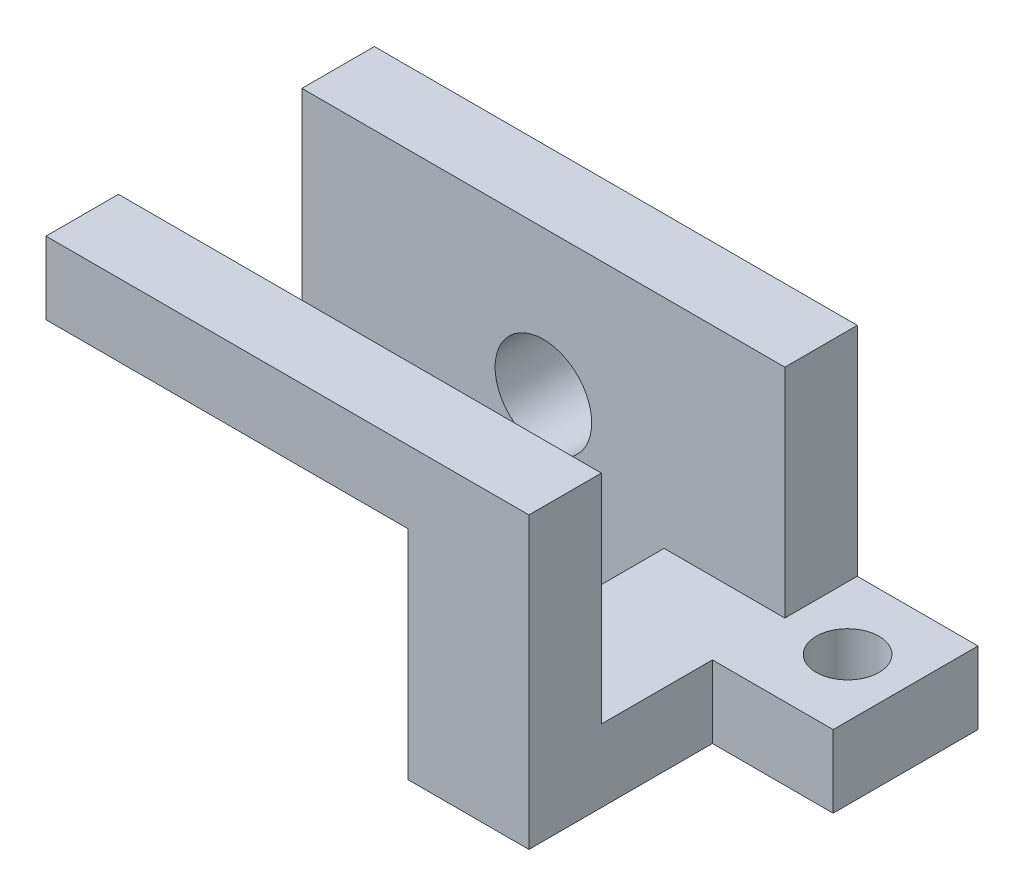
ISO-10303-21;
HEADER;
FILE_DESCRIPTION(('STEP AP214'),'2;1');
FILE_NAME('part.step','',(''),(''),'','','');
FILE_SCHEMA(('AUTOMOTIVE_DESIGN { 1 0 10303 214 1 1 1 1 }'));
ENDSEC;
DATA;
#1=APPLICATION_CONTEXT('core data for automotive mechanical design processes');
#2=APPLICATION_PROTOCOL_DEFINITION('international standard','automotive_design',2000,#1);
#3=PRODUCT_CONTEXT('',#1,'mechanical');
#4=PRODUCT('Part','Part','',(#3));
#5=PRODUCT_RELATED_PRODUCT_CATEGORY('part','',(#4));
#6=PRODUCT_DEFINITION_FORMATION('','',#4);
#7=PRODUCT_DEFINITION_CONTEXT('part definition',#1,'design');
#8=PRODUCT_DEFINITION('design','',#6,#7);
#9=PRODUCT_DEFINITION_SHAPE('','',#8);
#10=(LENGTH_UNIT() NAMED_UNIT(*) SI_UNIT(.MILLI.,.METRE.));
#11=(NAMED_UNIT(*) PLANE_ANGLE_UNIT() SI_UNIT($,.RADIAN.));
#12=(NAMED_UNIT(*) SI_UNIT($,.STERADIAN.) SOLID_ANGLE_UNIT());
#13=UNCERTAINTY_MEASURE_WITH_UNIT(LENGTH_MEASURE(1.E-05),#10,'distance_accuracy_value','');
#14=(GEOMETRIC_REPRESENTATION_CONTEXT(3) GLOBAL_UNCERTAINTY_ASSIGNED_CONTEXT((#13)) GLOBAL_UNIT_ASSIGNED_CONTEXT((#10,
#11,#12)) REPRESENTATION_CONTEXT('',''));
#15=CARTESIAN_POINT('',(0.,0.,0.));
#16=DIRECTION('',(0.,0.,1.));
#17=DIRECTION('',(1.,0.,0.));
#18=AXIS2_PLACEMENT_3D('',#15,#16,#17);
#19=CARTESIAN_POINT('',(75.,-30.,53.));
#20=DIRECTION('',(0.,1.,0.));
#21=DIRECTION('',(-1.,0.,0.));
#22=AXIS2_PLACEMENT_3D('',#19,#20,#21);
#23=PLANE('',#22);
#24=CARTESIAN_POINT('',(63.,-30.,0.));
#25=DIRECTION('',(0.,1.,0.));
#26=DIRECTION('',(0.,0.,1.));
#27=AXIS2_PLACEMENT_3D('',#24,#25,#26);
#28=CIRCLE('',#27,6.50000000000001);
#29=CARTESIAN_POINT('',(63.,-30.,6.50000000000001));
#30=VERTEX_POINT('',#29);
#31=EDGE_CURVE('E276',#30,#30,#28,.T.);
#32=ORIENTED_EDGE('',*,*,#31,.T.);
#33=EDGE_LOOP('',(#32));
#34=FACE_BOUND('',#33,.T.);
#35=DIRECTION('',(1.,0.,0.));
#36=VECTOR('',#35,1.);
#37=CARTESIAN_POINT('',(-50.,-30.,0.));
#38=LINE('',#37,#36);
#39=CARTESIAN_POINT('',(-50.,-30.,0.));
#40=VERTEX_POINT('',#39);
#41=CARTESIAN_POINT('',(25.,-30.,0.));
#42=VERTEX_POINT('',#41);
#43=EDGE_CURVE('E150',#40,#42,#38,.T.);
#44=ORIENTED_EDGE('',*,*,#43,.F.);
#45=DIRECTION('',(0.,0.,-1.));
#46=VECTOR('',#45,1.);
#47=CARTESIAN_POINT('',(-50.,-30.,53.));
#48=LINE('',#47,#46);
#49=CARTESIAN_POINT('',(-50.,-30.,-15.));
#50=VERTEX_POINT('',#49);
#51=EDGE_CURVE('E163',#40,#50,#48,.T.);
#52=ORIENTED_EDGE('',*,*,#51,.T.);
#53=DIRECTION('',(1.,0.,0.));
#54=VECTOR('',#53,1.);
#55=CARTESIAN_POINT('',(75.,-30.,-15.));
#56=LINE('',#55,#54);
#57=CARTESIAN_POINT('',(75.,-30.,-15.));
#58=VERTEX_POINT('',#57);
#59=EDGE_CURVE('E214',#50,#58,#56,.T.);
#60=ORIENTED_EDGE('',*,*,#59,.T.);
#61=DIRECTION('',(0.,0.,-1.));
#62=VECTOR('',#61,1.);
#63=CARTESIAN_POINT('',(75.,-30.,53.));
#64=LINE('',#63,#62);
#65=CARTESIAN_POINT('',(75.,-30.,15.));
#66=VERTEX_POINT('',#65);
#67=EDGE_CURVE('E175',#66,#58,#64,.T.);
#68=ORIENTED_EDGE('',*,*,#67,.F.);
#69=DIRECTION('',(-1.,0.,0.));
#70=VECTOR('',#69,1.);
#71=CARTESIAN_POINT('',(75.,-30.,15.));
#72=LINE('',#71,#70);
#73=CARTESIAN_POINT('',(50.,-30.,15.));
#74=VERTEX_POINT('',#73);
#75=EDGE_CURVE('E234',#66,#74,#72,.T.);
#76=ORIENTED_EDGE('',*,*,#75,.T.);
#77=DIRECTION('',(0.,0.,1.));
#78=VECTOR('',#77,1.);
#79=CARTESIAN_POINT('',(50.,-30.,53.));
#80=LINE('',#79,#78);
#81=CARTESIAN_POINT('',(50.,-30.,53.));
#82=VERTEX_POINT('',#81);
#83=EDGE_CURVE('E239',#74,#82,#80,.T.);
#84=ORIENTED_EDGE('',*,*,#83,.T.);
#85=DIRECTION('',(1.,0.,0.));
#86=VECTOR('',#85,1.);
#87=CARTESIAN_POINT('',(75.,-30.,53.));
#88=LINE('',#87,#86);
#89=CARTESIAN_POINT('',(25.,-30.,53.));
#90=VERTEX_POINT('',#89);
#91=EDGE_CURVE('E207',#90,#82,#88,.T.);
#92=ORIENTED_EDGE('',*,*,#91,.F.);
#93=DIRECTION('',(0.,0.,1.));
#94=VECTOR('',#93,1.);
#95=CARTESIAN_POINT('',(25.,-30.,0.));
#96=LINE('',#95,#94);
#97=EDGE_CURVE('E165',#42,#90,#96,.T.);
#98=ORIENTED_EDGE('',*,*,#97,.F.);
#99=EDGE_LOOP('',(#44,#52,#60,#68,#76,#84,#92,#98));
#100=FACE_BOUND('',#99,.T.);
#101=ADVANCED_FACE('F44',(#34,#100),#23,.F.);
#102=CARTESIAN_POINT('',(-50.,-30.,53.));
#103=DIRECTION('',(1.,0.,0.));
#104=DIRECTION('',(0.,0.,-1.));
#105=AXIS2_PLACEMENT_3D('',#102,#103,#104);
#106=PLANE('',#105);
#107=ORIENTED_EDGE('',*,*,#51,.F.);
#108=DIRECTION('',(0.,1.,0.));
#109=VECTOR('',#108,1.);
#110=CARTESIAN_POINT('',(-50.,30.,0.));
#111=LINE('',#110,#109);
#112=CARTESIAN_POINT('',(-50.,30.,0.));
#113=VERTEX_POINT('',#112);
#114=EDGE_CURVE('E144',#40,#113,#111,.T.);
#115=ORIENTED_EDGE('',*,*,#114,.T.);
#116=DIRECTION('',(0.,0.,-1.));
#117=VECTOR('',#116,1.);
#118=CARTESIAN_POINT('',(-50.,30.,53.));
#119=LINE('',#118,#117);
#120=CARTESIAN_POINT('',(-50.,30.,-15.));
#121=VERTEX_POINT('',#120);
#122=EDGE_CURVE('E212',#113,#121,#119,.T.);
#123=ORIENTED_EDGE('',*,*,#122,.T.);
#124=DIRECTION('',(0.,-1.,0.));
#125=VECTOR('',#124,1.);
#126=CARTESIAN_POINT('',(-50.,-30.,-15.));
#127=LINE('',#126,#125);
#128=EDGE_CURVE('E167',#121,#50,#127,.T.);
#129=ORIENTED_EDGE('',*,*,#128,.T.);
#130=EDGE_LOOP('',(#107,#115,#123,#129));
#131=FACE_BOUND('',#130,.T.);
#132=ADVANCED_FACE('F166',(#131),#106,.F.);
#133=CARTESIAN_POINT('',(75.,30.,53.));
#134=DIRECTION('',(0.,-1.,0.));
#135=DIRECTION('',(1.,0.,0.));
#136=AXIS2_PLACEMENT_3D('',#133,#134,#135);
#137=PLANE('',#136);
#138=DIRECTION('',(0.,0.,1.));
#139=VECTOR('',#138,1.);
#140=CARTESIAN_POINT('',(50.,30.,53.));
#141=LINE('',#140,#139);
#142=CARTESIAN_POINT('',(50.,30.,38.));
#143=VERTEX_POINT('',#142);
#144=CARTESIAN_POINT('',(50.,30.,53.));
#145=VERTEX_POINT('',#144);
#146=EDGE_CURVE('E295',#143,#145,#141,.T.);
#147=ORIENTED_EDGE('',*,*,#146,.F.);
#148=DIRECTION('',(1.,0.,0.));
#149=VECTOR('',#148,1.);
#150=CARTESIAN_POINT('',(-50.,30.,38.));
#151=LINE('',#150,#149);
#152=CARTESIAN_POINT('',(-50.,30.,38.));
#153=VERTEX_POINT('',#152);
#154=EDGE_CURVE('E211',#153,#143,#151,.T.);
#155=ORIENTED_EDGE('',*,*,#154,.F.);
#156=CARTESIAN_POINT('',(-50.,30.,53.));
#157=VERTEX_POINT('',#156);
#158=EDGE_CURVE('E176',#157,#153,#119,.T.);
#159=ORIENTED_EDGE('',*,*,#158,.F.);
#160=DIRECTION('',(-1.,0.,0.));
#161=VECTOR('',#160,1.);
#162=CARTESIAN_POINT('',(75.,30.,53.));
#163=LINE('',#162,#161);
#164=EDGE_CURVE('E209',#145,#157,#163,.T.);
#165=ORIENTED_EDGE('',*,*,#164,.F.);
#166=EDGE_LOOP('',(#147,#155,#159,#165));
#167=FACE_BOUND('',#166,.T.);
#168=ADVANCED_FACE('F299',(#167),#137,.F.);
#169=CARTESIAN_POINT('',(0.,0.,53.));
#170=DIRECTION('',(0.,0.,1.));
#171=DIRECTION('',(1.,0.,0.));
#172=AXIS2_PLACEMENT_3D('',#169,#170,#171);
#173=PLANE('',#172);
#174=DIRECTION('',(0.,1.,0.));
#175=VECTOR('',#174,1.);
#176=CARTESIAN_POINT('',(25.,-30.,53.));
#177=LINE('',#176,#175);
#178=CARTESIAN_POINT('',(25.,15.,53.));
#179=VERTEX_POINT('',#178);
#180=EDGE_CURVE('E280',#90,#179,#177,.T.);
#181=ORIENTED_EDGE('',*,*,#180,.F.);
#182=ORIENTED_EDGE('',*,*,#91,.T.);
#183=DIRECTION('',(0.,1.,0.));
#184=VECTOR('',#183,1.);
#185=CARTESIAN_POINT('',(50.,-30.,53.));
#186=LINE('',#185,#184);
#187=EDGE_CURVE('E243',#82,#145,#186,.T.);
#188=ORIENTED_EDGE('',*,*,#187,.T.);
#189=ORIENTED_EDGE('',*,*,#164,.T.);
#190=DIRECTION('',(0.,-1.,0.));
#191=VECTOR('',#190,1.);
#192=CARTESIAN_POINT('',(-50.,-30.,53.));
#193=LINE('',#192,#191);
#194=CARTESIAN_POINT('',(-50.,15.,53.));
#195=VERTEX_POINT('',#194);
#196=EDGE_CURVE('E202',#157,#195,#193,.T.);
#197=ORIENTED_EDGE('',*,*,#196,.T.);
#198=DIRECTION('',(-1.,0.,0.));
#199=VECTOR('',#198,1.);
#200=CARTESIAN_POINT('',(-50.,15.,53.));
#201=LINE('',#200,#199);
#202=EDGE_CURVE('E164',#179,#195,#201,.T.);
#203=ORIENTED_EDGE('',*,*,#202,.F.);
#204=EDGE_LOOP('',(#181,#182,#188,#189,#197,#203));
#205=FACE_BOUND('',#204,.T.);
#206=ADVANCED_FACE('F271',(#205),#173,.T.);
#207=CARTESIAN_POINT('',(75.,-30.,53.));
#208=DIRECTION('',(-1.,0.,0.));
#209=DIRECTION('',(0.,-1.,0.));
#210=AXIS2_PLACEMENT_3D('',#207,#208,#209);
#211=PLANE('',#210);
#212=DIRECTION('',(0.,1.,0.));
#213=VECTOR('',#212,1.);
#214=CARTESIAN_POINT('',(75.,-30.,15.));
#215=LINE('',#214,#213);
#216=CARTESIAN_POINT('',(75.,-15.,15.));
#217=VERTEX_POINT('',#216);
#218=EDGE_CURVE('E66',#66,#217,#215,.T.);
#219=ORIENTED_EDGE('',*,*,#218,.F.);
#220=ORIENTED_EDGE('',*,*,#67,.T.);
#221=DIRECTION('',(0.,1.,0.));
#222=VECTOR('',#221,1.);
#223=CARTESIAN_POINT('',(75.,-30.,-15.));
#224=LINE('',#223,#222);
#225=CARTESIAN_POINT('',(75.,-15.,-15.));
#226=VERTEX_POINT('',#225);
#227=EDGE_CURVE('E218',#58,#226,#224,.T.);
#228=ORIENTED_EDGE('',*,*,#227,.T.);
#229=DIRECTION('',(0.,0.,-1.));
#230=VECTOR('',#229,1.);
#231=CARTESIAN_POINT('',(75.,-15.,38.));
#232=LINE('',#231,#230);
#233=EDGE_CURVE('E238',#217,#226,#232,.T.);
#234=ORIENTED_EDGE('',*,*,#233,.F.);
#235=EDGE_LOOP('',(#219,#220,#228,#234));
#236=FACE_BOUND('',#235,.T.);
#237=ADVANCED_FACE('F236',(#236),#211,.F.);
#238=DIRECTION('',(0.,0.,1.));
#239=VECTOR('',#238,1.);
#240=CARTESIAN_POINT('',(50.,30.,-15.));
#241=LINE('',#240,#239);
#242=CARTESIAN_POINT('',(50.,30.,-15.));
#243=VERTEX_POINT('',#242);
#244=CARTESIAN_POINT('',(50.,30.,0.));
#245=VERTEX_POINT('',#244);
#246=EDGE_CURVE('E248',#243,#245,#241,.T.);
#247=ORIENTED_EDGE('',*,*,#246,.F.);
#248=DIRECTION('',(-1.,0.,0.));
#249=VECTOR('',#248,1.);
#250=CARTESIAN_POINT('',(75.,30.,-15.));
#251=LINE('',#250,#249);
#252=EDGE_CURVE('E210',#243,#121,#251,.T.);
#253=ORIENTED_EDGE('',*,*,#252,.T.);
#254=ORIENTED_EDGE('',*,*,#122,.F.);
#255=DIRECTION('',(1.,0.,0.));
#256=VECTOR('',#255,1.);
#257=CARTESIAN_POINT('',(-50.,30.,0.));
#258=LINE('',#257,#256);
#259=EDGE_CURVE('E153',#113,#245,#258,.T.);
#260=ORIENTED_EDGE('',*,*,#259,.T.);
#261=EDGE_LOOP('',(#247,#253,#254,#260));
#262=FACE_BOUND('',#261,.T.);
#263=ADVANCED_FACE('F263',(#262),#137,.F.);
#264=CARTESIAN_POINT('',(0.,0.,-15.));
#265=DIRECTION('',(0.,0.,1.));
#266=DIRECTION('',(1.,0.,0.));
#267=AXIS2_PLACEMENT_3D('',#264,#265,#266);
#268=PLANE('',#267);
#269=CARTESIAN_POINT('',(0.,0.,-15.));
#270=DIRECTION('',(0.,0.,1.));
#271=DIRECTION('',(1.,0.,0.));
#272=AXIS2_PLACEMENT_3D('',#269,#270,#271);
#273=CIRCLE('',#272,10.);
#274=CARTESIAN_POINT('',(10.,0.,-15.));
#275=VERTEX_POINT('',#274);
#276=EDGE_CURVE('E453',#275,#275,#273,.T.);
#277=ORIENTED_EDGE('',*,*,#276,.T.);
#278=EDGE_LOOP('',(#277));
#279=FACE_BOUND('',#278,.T.);
#280=DIRECTION('',(-1.,0.,0.));
#281=VECTOR('',#280,1.);
#282=CARTESIAN_POINT('',(50.,-15.,-15.));
#283=LINE('',#282,#281);
#284=CARTESIAN_POINT('',(50.,-15.,-15.));
#285=VERTEX_POINT('',#284);
#286=EDGE_CURVE('E249',#226,#285,#283,.T.);
#287=ORIENTED_EDGE('',*,*,#286,.F.);
#288=ORIENTED_EDGE('',*,*,#227,.F.);
#289=ORIENTED_EDGE('',*,*,#59,.F.);
#290=ORIENTED_EDGE('',*,*,#128,.F.);
#291=ORIENTED_EDGE('',*,*,#252,.F.);
#292=DIRECTION('',(0.,1.,0.));
#293=VECTOR('',#292,1.);
#294=CARTESIAN_POINT('',(50.,-15.,-15.));
#295=LINE('',#294,#293);
#296=EDGE_CURVE('E253',#285,#243,#295,.T.);
#297=ORIENTED_EDGE('',*,*,#296,.F.);
#298=EDGE_LOOP('',(#287,#288,#289,#290,#291,#297));
#299=FACE_BOUND('',#298,.T.);
#300=ADVANCED_FACE('F226',(#279,#299),#268,.F.);
#301=DIRECTION('',(0.,-1.,0.));
#302=VECTOR('',#301,1.);
#303=CARTESIAN_POINT('',(-50.,30.,38.));
#304=LINE('',#303,#302);
#305=CARTESIAN_POINT('',(-50.,15.,38.));
#306=VERTEX_POINT('',#305);
#307=EDGE_CURVE('E160',#153,#306,#304,.T.);
#308=ORIENTED_EDGE('',*,*,#307,.T.);
#309=DIRECTION('',(0.,0.,1.));
#310=VECTOR('',#309,1.);
#311=CARTESIAN_POINT('',(-50.,15.,0.));
#312=LINE('',#311,#310);
#313=EDGE_CURVE('E290',#306,#195,#312,.T.);
#314=ORIENTED_EDGE('',*,*,#313,.T.);
#315=ORIENTED_EDGE('',*,*,#196,.F.);
#316=ORIENTED_EDGE('',*,*,#158,.T.);
#317=EDGE_LOOP('',(#308,#314,#315,#316));
#318=FACE_BOUND('',#317,.T.);
#319=ADVANCED_FACE('F50',(#318),#106,.F.);
#320=CARTESIAN_POINT('',(-50.,30.,38.));
#321=DIRECTION('',(0.,0.,1.));
#322=DIRECTION('',(0.,-1.,0.));
#323=AXIS2_PLACEMENT_3D('',#320,#321,#322);
#324=PLANE('',#323);
#325=DIRECTION('',(0.,1.,0.));
#326=VECTOR('',#325,1.);
#327=CARTESIAN_POINT('',(25.,30.,38.));
#328=LINE('',#327,#326);
#329=CARTESIAN_POINT('',(25.,-15.,38.));
#330=VERTEX_POINT('',#329);
#331=CARTESIAN_POINT('',(25.,15.,38.));
#332=VERTEX_POINT('',#331);
#333=EDGE_CURVE('E198',#330,#332,#328,.T.);
#334=ORIENTED_EDGE('',*,*,#333,.T.);
#335=DIRECTION('',(-1.,0.,0.));
#336=VECTOR('',#335,1.);
#337=CARTESIAN_POINT('',(-50.,15.,38.));
#338=LINE('',#337,#336);
#339=EDGE_CURVE('E12',#332,#306,#338,.T.);
#340=ORIENTED_EDGE('',*,*,#339,.T.);
#341=ORIENTED_EDGE('',*,*,#307,.F.);
#342=ORIENTED_EDGE('',*,*,#154,.T.);
#343=DIRECTION('',(0.,-1.,0.));
#344=VECTOR('',#343,1.);
#345=CARTESIAN_POINT('',(50.,30.,38.));
#346=LINE('',#345,#344);
#347=CARTESIAN_POINT('',(50.,-15.,38.));
#348=VERTEX_POINT('',#347);
#349=EDGE_CURVE('E196',#143,#348,#346,.T.);
#350=ORIENTED_EDGE('',*,*,#349,.T.);
#351=DIRECTION('',(1.,0.,0.));
#352=VECTOR('',#351,1.);
#353=CARTESIAN_POINT('',(-50.,-15.,38.));
#354=LINE('',#353,#352);
#355=EDGE_CURVE('E156',#330,#348,#354,.T.);
#356=ORIENTED_EDGE('',*,*,#355,.F.);
#357=EDGE_LOOP('',(#334,#340,#341,#342,#350,#356));
#358=FACE_BOUND('',#357,.T.);
#359=ADVANCED_FACE('F193',(#358),#324,.F.);
#360=CARTESIAN_POINT('',(-50.,30.,0.));
#361=DIRECTION('',(0.,0.,-1.));
#362=DIRECTION('',(0.,1.,0.));
#363=AXIS2_PLACEMENT_3D('',#360,#361,#362);
#364=PLANE('',#363);
#365=CARTESIAN_POINT('',(0.,0.,0.));
#366=DIRECTION('',(0.,0.,1.));
#367=DIRECTION('',(1.,0.,0.));
#368=AXIS2_PLACEMENT_3D('',#365,#366,#367);
#369=CIRCLE('',#368,10.);
#370=CARTESIAN_POINT('',(10.,0.,0.));
#371=VERTEX_POINT('',#370);
#372=EDGE_CURVE('E456',#371,#371,#369,.T.);
#373=ORIENTED_EDGE('',*,*,#372,.F.);
#374=EDGE_LOOP('',(#373));
#375=FACE_BOUND('',#374,.T.);
#376=ORIENTED_EDGE('',*,*,#259,.F.);
#377=ORIENTED_EDGE('',*,*,#114,.F.);
#378=ORIENTED_EDGE('',*,*,#43,.T.);
#379=DIRECTION('',(0.,1.,0.));
#380=VECTOR('',#379,1.);
#381=CARTESIAN_POINT('',(25.,-30.,0.));
#382=LINE('',#381,#380);
#383=CARTESIAN_POINT('',(25.,-15.,0.));
#384=VERTEX_POINT('',#383);
#385=EDGE_CURVE('E58',#42,#384,#382,.T.);
#386=ORIENTED_EDGE('',*,*,#385,.T.);
#387=DIRECTION('',(1.,0.,0.));
#388=VECTOR('',#387,1.);
#389=CARTESIAN_POINT('',(-50.,-15.,0.));
#390=LINE('',#389,#388);
#391=CARTESIAN_POINT('',(50.,-15.,0.));
#392=VERTEX_POINT('',#391);
#393=EDGE_CURVE('E188',#384,#392,#390,.T.);
#394=ORIENTED_EDGE('',*,*,#393,.T.);
#395=DIRECTION('',(0.,1.,0.));
#396=VECTOR('',#395,1.);
#397=CARTESIAN_POINT('',(50.,30.,0.));
#398=LINE('',#397,#396);
#399=EDGE_CURVE('E171',#392,#245,#398,.T.);
#400=ORIENTED_EDGE('',*,*,#399,.T.);
#401=EDGE_LOOP('',(#376,#377,#378,#386,#394,#400));
#402=FACE_BOUND('',#401,.T.);
#403=ADVANCED_FACE('F147',(#375,#402),#364,.F.);
#404=CARTESIAN_POINT('',(-50.,-15.,38.));
#405=DIRECTION('',(0.,-1.,0.));
#406=DIRECTION('',(0.,0.,-1.));
#407=AXIS2_PLACEMENT_3D('',#404,#405,#406);
#408=PLANE('',#407);
#409=CARTESIAN_POINT('',(63.,-15.,0.));
#410=DIRECTION('',(0.,1.,0.));
#411=DIRECTION('',(0.,0.,1.));
#412=AXIS2_PLACEMENT_3D('',#409,#410,#411);
#413=CIRCLE('',#412,6.50000000000001);
#414=CARTESIAN_POINT('',(63.,-15.,6.50000000000001));
#415=VERTEX_POINT('',#414);
#416=EDGE_CURVE('E281',#415,#415,#413,.T.);
#417=ORIENTED_EDGE('',*,*,#416,.F.);
#418=EDGE_LOOP('',(#417));
#419=FACE_BOUND('',#418,.T.);
#420=ORIENTED_EDGE('',*,*,#393,.F.);
#421=DIRECTION('',(0.,0.,1.));
#422=VECTOR('',#421,1.);
#423=CARTESIAN_POINT('',(25.,-15.,38.));
#424=LINE('',#423,#422);
#425=EDGE_CURVE('E52',#384,#330,#424,.T.);
#426=ORIENTED_EDGE('',*,*,#425,.T.);
#427=ORIENTED_EDGE('',*,*,#355,.T.);
#428=DIRECTION('',(0.,0.,-1.));
#429=VECTOR('',#428,1.);
#430=CARTESIAN_POINT('',(50.,-15.,38.));
#431=LINE('',#430,#429);
#432=CARTESIAN_POINT('',(50.,-15.,15.));
#433=VERTEX_POINT('',#432);
#434=EDGE_CURVE('E181',#348,#433,#431,.T.);
#435=ORIENTED_EDGE('',*,*,#434,.T.);
#436=DIRECTION('',(1.,0.,0.));
#437=VECTOR('',#436,1.);
#438=CARTESIAN_POINT('',(-50.,-15.,15.));
#439=LINE('',#438,#437);
#440=EDGE_CURVE('E172',#433,#217,#439,.T.);
#441=ORIENTED_EDGE('',*,*,#440,.T.);
#442=ORIENTED_EDGE('',*,*,#233,.T.);
#443=ORIENTED_EDGE('',*,*,#286,.T.);
#444=DIRECTION('',(0.,0.,1.));
#445=VECTOR('',#444,1.);
#446=CARTESIAN_POINT('',(50.,-15.,-15.));
#447=LINE('',#446,#445);
#448=EDGE_CURVE('E254',#285,#392,#447,.T.);
#449=ORIENTED_EDGE('',*,*,#448,.T.);
#450=EDGE_LOOP('',(#420,#426,#427,#435,#441,#442,#443,#449));
#451=FACE_BOUND('',#450,.T.);
#452=ADVANCED_FACE('F190',(#419,#451),#408,.F.);
#453=CARTESIAN_POINT('',(50.,-15.,-15.));
#454=DIRECTION('',(-1.,0.,0.));
#455=DIRECTION('',(0.,0.,1.));
#456=AXIS2_PLACEMENT_3D('',#453,#454,#455);
#457=PLANE('',#456);
#458=ORIENTED_EDGE('',*,*,#448,.F.);
#459=ORIENTED_EDGE('',*,*,#296,.T.);
#460=ORIENTED_EDGE('',*,*,#246,.T.);
#461=ORIENTED_EDGE('',*,*,#399,.F.);
#462=EDGE_LOOP('',(#458,#459,#460,#461));
#463=FACE_BOUND('',#462,.T.);
#464=ADVANCED_FACE('F262',(#463),#457,.F.);
#465=CARTESIAN_POINT('',(50.,-30.,53.));
#466=DIRECTION('',(-1.,0.,0.));
#467=DIRECTION('',(0.,-1.,0.));
#468=AXIS2_PLACEMENT_3D('',#465,#466,#467);
#469=PLANE('',#468);
#470=ORIENTED_EDGE('',*,*,#146,.T.);
#471=ORIENTED_EDGE('',*,*,#187,.F.);
#472=ORIENTED_EDGE('',*,*,#83,.F.);
#473=DIRECTION('',(0.,1.,0.));
#474=VECTOR('',#473,1.);
#475=CARTESIAN_POINT('',(50.,-30.,15.));
#476=LINE('',#475,#474);
#477=EDGE_CURVE('E237',#74,#433,#476,.T.);
#478=ORIENTED_EDGE('',*,*,#477,.T.);
#479=ORIENTED_EDGE('',*,*,#434,.F.);
#480=ORIENTED_EDGE('',*,*,#349,.F.);
#481=EDGE_LOOP('',(#470,#471,#472,#478,#479,#480));
#482=FACE_BOUND('',#481,.T.);
#483=ADVANCED_FACE('F267',(#482),#469,.F.);
#484=CARTESIAN_POINT('',(75.,-30.,15.));
#485=DIRECTION('',(0.,0.,-1.));
#486=DIRECTION('',(-1.,0.,0.));
#487=AXIS2_PLACEMENT_3D('',#484,#485,#486);
#488=PLANE('',#487);
#489=ORIENTED_EDGE('',*,*,#477,.F.);
#490=ORIENTED_EDGE('',*,*,#75,.F.);
#491=ORIENTED_EDGE('',*,*,#218,.T.);
#492=ORIENTED_EDGE('',*,*,#440,.F.);
#493=EDGE_LOOP('',(#489,#490,#491,#492));
#494=FACE_BOUND('',#493,.T.);
#495=ADVANCED_FACE('F264',(#494),#488,.F.);
#496=CARTESIAN_POINT('',(-50.,15.,0.));
#497=DIRECTION('',(0.,1.,0.));
#498=DIRECTION('',(0.,0.,1.));
#499=AXIS2_PLACEMENT_3D('',#496,#497,#498);
#500=PLANE('',#499);
#501=DIRECTION('',(0.,0.,1.));
#502=VECTOR('',#501,1.);
#503=CARTESIAN_POINT('',(25.,15.,0.));
#504=LINE('',#503,#502);
#505=EDGE_CURVE('E289',#332,#179,#504,.T.);
#506=ORIENTED_EDGE('',*,*,#505,.T.);
#507=ORIENTED_EDGE('',*,*,#202,.T.);
#508=ORIENTED_EDGE('',*,*,#313,.F.);
#509=ORIENTED_EDGE('',*,*,#339,.F.);
#510=EDGE_LOOP('',(#506,#507,#508,#509));
#511=FACE_BOUND('',#510,.T.);
#512=ADVANCED_FACE('F301',(#511),#500,.F.);
#513=CARTESIAN_POINT('',(25.,-30.,0.));
#514=DIRECTION('',(1.,0.,0.));
#515=DIRECTION('',(0.,0.,-1.));
#516=AXIS2_PLACEMENT_3D('',#513,#514,#515);
#517=PLANE('',#516);
#518=ORIENTED_EDGE('',*,*,#425,.F.);
#519=ORIENTED_EDGE('',*,*,#385,.F.);
#520=ORIENTED_EDGE('',*,*,#97,.T.);
#521=ORIENTED_EDGE('',*,*,#180,.T.);
#522=ORIENTED_EDGE('',*,*,#505,.F.);
#523=ORIENTED_EDGE('',*,*,#333,.F.);
#524=EDGE_LOOP('',(#518,#519,#520,#521,#522,#523));
#525=FACE_BOUND('',#524,.T.);
#526=ADVANCED_FACE('F305',(#525),#517,.F.);
#527=CARTESIAN_POINT('',(63.,-15.,0.));
#528=DIRECTION('',(0.,1.,0.));
#529=DIRECTION('',(0.,0.,1.));
#530=AXIS2_PLACEMENT_3D('',#527,#528,#529);
#531=CYLINDRICAL_SURFACE('',#530,6.50000000000001);
#532=ORIENTED_EDGE('',*,*,#31,.F.);
#533=EDGE_LOOP('',(#532));
#534=FACE_BOUND('',#533,.T.);
#535=ORIENTED_EDGE('',*,*,#416,.T.);
#536=EDGE_LOOP('',(#535));
#537=FACE_BOUND('',#536,.T.);
#538=ADVANCED_FACE('F302',(#534,#537),#531,.F.);
#539=CARTESIAN_POINT('',(0.,0.,0.));
#540=DIRECTION('',(0.,0.,1.));
#541=DIRECTION('',(1.,0.,0.));
#542=AXIS2_PLACEMENT_3D('',#539,#540,#541);
#543=CYLINDRICAL_SURFACE('',#542,10.);
#544=ORIENTED_EDGE('',*,*,#276,.F.);
#545=EDGE_LOOP('',(#544));
#546=FACE_BOUND('',#545,.T.);
#547=ORIENTED_EDGE('',*,*,#372,.T.);
#548=EDGE_LOOP('',(#547));
#549=FACE_BOUND('',#548,.T.);
#550=ADVANCED_FACE('F311',(#546,#549),#543,.F.);
#551=CLOSED_SHELL('',(#101,#132,#168,#206,#237,#263,#300,#319,#359,#403,#452,#464,#483,#495,
#512,#526,#538,#550));
#552=MANIFOLD_SOLID_BREP('B2',#551);
#553=ADVANCED_BREP_SHAPE_REPRESENTATION('',(#18,#552),#14);
#554=SHAPE_DEFINITION_REPRESENTATION(#9,#553);
ENDSEC;
END-ISO-10303-21;
